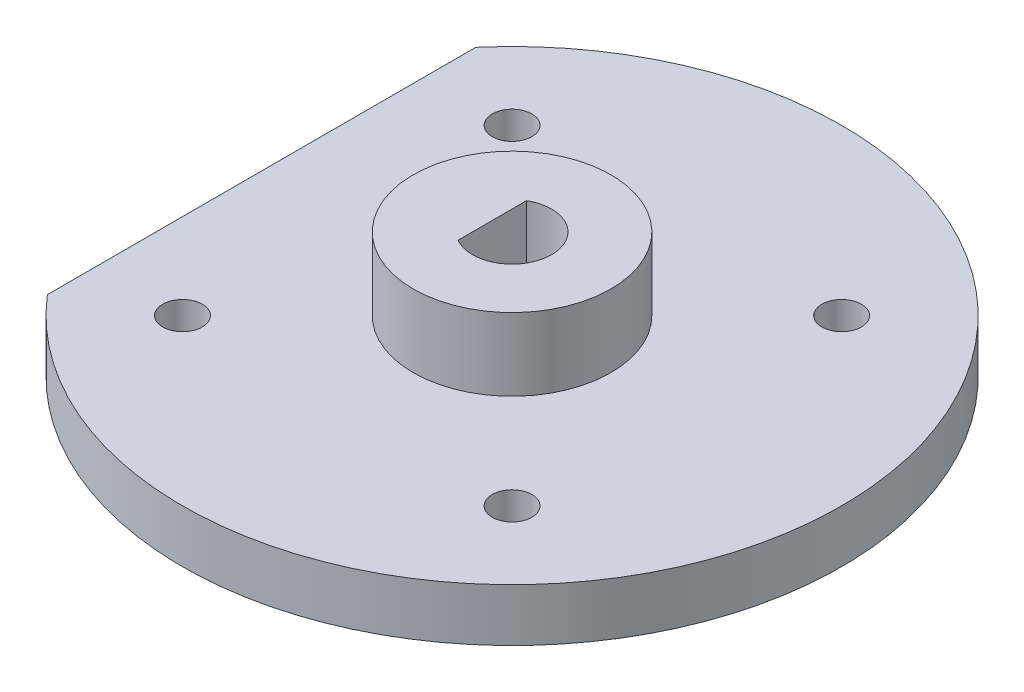
ISO-10303-21;
HEADER;
FILE_DESCRIPTION(('STEP AP214'),'2;1');
FILE_NAME('part.step','',(''),(''),'','','');
FILE_SCHEMA(('AUTOMOTIVE_DESIGN { 1 0 10303 214 1 1 1 1 }'));
ENDSEC;
DATA;
#1=APPLICATION_CONTEXT('core data for automotive mechanical design processes');
#2=APPLICATION_PROTOCOL_DEFINITION('international standard','automotive_design',2000,#1);
#3=PRODUCT_CONTEXT('',#1,'mechanical');
#4=PRODUCT('Part','Part','',(#3));
#5=PRODUCT_RELATED_PRODUCT_CATEGORY('part','',(#4));
#6=PRODUCT_DEFINITION_FORMATION('','',#4);
#7=PRODUCT_DEFINITION_CONTEXT('part definition',#1,'design');
#8=PRODUCT_DEFINITION('design','',#6,#7);
#9=PRODUCT_DEFINITION_SHAPE('','',#8);
#10=(LENGTH_UNIT() NAMED_UNIT(*) SI_UNIT(.MILLI.,.METRE.));
#11=(NAMED_UNIT(*) PLANE_ANGLE_UNIT() SI_UNIT($,.RADIAN.));
#12=(NAMED_UNIT(*) SI_UNIT($,.STERADIAN.) SOLID_ANGLE_UNIT());
#13=UNCERTAINTY_MEASURE_WITH_UNIT(LENGTH_MEASURE(1.E-05),#10,'distance_accuracy_value','');
#14=(GEOMETRIC_REPRESENTATION_CONTEXT(3) GLOBAL_UNCERTAINTY_ASSIGNED_CONTEXT((#13)) GLOBAL_UNIT_ASSIGNED_CONTEXT((#10,
#11,#12)) REPRESENTATION_CONTEXT('',''));
#15=CARTESIAN_POINT('',(0.,0.,0.));
#16=DIRECTION('',(0.,0.,1.));
#17=DIRECTION('',(1.,0.,0.));
#18=AXIS2_PLACEMENT_3D('',#15,#16,#17);
#19=CARTESIAN_POINT('',(0.,4.,0.));
#20=DIRECTION('',(0.,1.,0.));
#21=DIRECTION('',(0.,0.,1.));
#22=AXIS2_PLACEMENT_3D('',#19,#20,#21);
#23=PLANE('',#22);
#24=CARTESIAN_POINT('',(-12.5,4.,-12.5));
#25=DIRECTION('',(0.,1.,0.));
#26=DIRECTION('',(0.,0.,1.));
#27=AXIS2_PLACEMENT_3D('',#24,#25,#26);
#28=CIRCLE('',#27,1.5);
#29=CARTESIAN_POINT('',(-12.5,4.,-11.));
#30=VERTEX_POINT('',#29);
#31=EDGE_CURVE('E109',#30,#30,#28,.T.);
#32=ORIENTED_EDGE('',*,*,#31,.F.);
#33=EDGE_LOOP('',(#32));
#34=FACE_BOUND('',#33,.T.);
#35=CARTESIAN_POINT('',(12.5,4.,12.5));
#36=DIRECTION('',(0.,1.,0.));
#37=DIRECTION('',(0.,0.,1.));
#38=AXIS2_PLACEMENT_3D('',#35,#36,#37);
#39=CIRCLE('',#38,1.5);
#40=CARTESIAN_POINT('',(12.5,4.,14.));
#41=VERTEX_POINT('',#40);
#42=EDGE_CURVE('E97',#41,#41,#39,.T.);
#43=ORIENTED_EDGE('',*,*,#42,.F.);
#44=EDGE_LOOP('',(#43));
#45=FACE_BOUND('',#44,.T.);
#46=CARTESIAN_POINT('',(0.,4.,0.));
#47=DIRECTION('',(0.,1.,0.));
#48=DIRECTION('',(0.,0.,1.));
#49=AXIS2_PLACEMENT_3D('',#46,#47,#48);
#50=CIRCLE('',#49,25.);
#51=CARTESIAN_POINT('',(-19.,4.,16.2480768092719));
#52=VERTEX_POINT('',#51);
#53=CARTESIAN_POINT('',(-19.,4.,-16.2480768092719));
#54=VERTEX_POINT('',#53);
#55=EDGE_CURVE('E75',#52,#54,#50,.T.);
#56=ORIENTED_EDGE('',*,*,#55,.T.);
#57=DIRECTION('',(0.,0.,1.));
#58=VECTOR('',#57,1.);
#59=CARTESIAN_POINT('',(-19.,4.,-16.2480768092719));
#60=LINE('',#59,#58);
#61=EDGE_CURVE('E56',#54,#52,#60,.T.);
#62=ORIENTED_EDGE('',*,*,#61,.T.);
#63=EDGE_LOOP('',(#56,#62));
#64=FACE_BOUND('',#63,.T.);
#65=CARTESIAN_POINT('',(12.5,4.,-12.5));
#66=DIRECTION('',(0.,1.,0.));
#67=DIRECTION('',(0.,0.,1.));
#68=AXIS2_PLACEMENT_3D('',#65,#66,#67);
#69=CIRCLE('',#68,1.5);
#70=CARTESIAN_POINT('',(12.5,4.,-11.));
#71=VERTEX_POINT('',#70);
#72=EDGE_CURVE('E93',#71,#71,#69,.T.);
#73=ORIENTED_EDGE('',*,*,#72,.F.);
#74=EDGE_LOOP('',(#73));
#75=FACE_BOUND('',#74,.T.);
#76=CARTESIAN_POINT('',(-12.5,4.,12.5));
#77=DIRECTION('',(0.,1.,0.));
#78=DIRECTION('',(0.,0.,1.));
#79=AXIS2_PLACEMENT_3D('',#76,#77,#78);
#80=CIRCLE('',#79,1.5);
#81=CARTESIAN_POINT('',(-12.5,4.,14.));
#82=VERTEX_POINT('',#81);
#83=EDGE_CURVE('E103',#82,#82,#80,.T.);
#84=ORIENTED_EDGE('',*,*,#83,.F.);
#85=EDGE_LOOP('',(#84));
#86=FACE_BOUND('',#85,.T.);
#87=CARTESIAN_POINT('',(0.,4.,0.));
#88=DIRECTION('',(0.,1.,0.));
#89=DIRECTION('',(0.,0.,1.));
#90=AXIS2_PLACEMENT_3D('',#87,#88,#89);
#91=CIRCLE('',#90,7.5);
#92=CARTESIAN_POINT('',(0.,4.,7.5));
#93=VERTEX_POINT('',#92);
#94=EDGE_CURVE('E118',#93,#93,#91,.T.);
#95=ORIENTED_EDGE('',*,*,#94,.F.);
#96=EDGE_LOOP('',(#95));
#97=FACE_BOUND('',#96,.T.);
#98=ADVANCED_FACE('F33',(#34,#45,#64,#75,#86,#97),#23,.T.);
#99=CARTESIAN_POINT('',(0.,0.,0.));
#100=DIRECTION('',(0.,1.,0.));
#101=DIRECTION('',(0.,0.,1.));
#102=AXIS2_PLACEMENT_3D('',#99,#100,#101);
#103=PLANE('',#102);
#104=CARTESIAN_POINT('',(0.,0.,0.));
#105=DIRECTION('',(0.,1.,0.));
#106=DIRECTION('',(0.,0.,1.));
#107=AXIS2_PLACEMENT_3D('',#104,#105,#106);
#108=CIRCLE('',#107,25.);
#109=CARTESIAN_POINT('',(-19.,0.,16.2480768092719));
#110=VERTEX_POINT('',#109);
#111=CARTESIAN_POINT('',(-19.,0.,-16.2480768092719));
#112=VERTEX_POINT('',#111);
#113=EDGE_CURVE('E76',#110,#112,#108,.T.);
#114=ORIENTED_EDGE('',*,*,#113,.F.);
#115=DIRECTION('',(0.,0.,1.));
#116=VECTOR('',#115,1.);
#117=CARTESIAN_POINT('',(-19.,0.,-16.2480768092719));
#118=LINE('',#117,#116);
#119=EDGE_CURVE('E67',#112,#110,#118,.T.);
#120=ORIENTED_EDGE('',*,*,#119,.F.);
#121=EDGE_LOOP('',(#114,#120));
#122=FACE_BOUND('',#121,.T.);
#123=CARTESIAN_POINT('',(0.,0.,0.));
#124=DIRECTION('',(0.,1.,0.));
#125=DIRECTION('',(0.,0.,1.));
#126=AXIS2_PLACEMENT_3D('',#123,#124,#125);
#127=CIRCLE('',#126,3.);
#128=CARTESIAN_POINT('',(-1.5,0.,2.59807621135332));
#129=VERTEX_POINT('',#128);
#130=CARTESIAN_POINT('',(-1.5,0.,-2.59807621135332));
#131=VERTEX_POINT('',#130);
#132=EDGE_CURVE('E48',#129,#131,#127,.T.);
#133=ORIENTED_EDGE('',*,*,#132,.T.);
#134=DIRECTION('',(0.,0.,1.));
#135=VECTOR('',#134,1.);
#136=CARTESIAN_POINT('',(-1.5,0.,-2.59807621135332));
#137=LINE('',#136,#135);
#138=EDGE_CURVE('E89',#131,#129,#137,.T.);
#139=ORIENTED_EDGE('',*,*,#138,.T.);
#140=EDGE_LOOP('',(#133,#139));
#141=FACE_BOUND('',#140,.T.);
#142=CARTESIAN_POINT('',(12.5,0.,-12.5));
#143=DIRECTION('',(0.,1.,0.));
#144=DIRECTION('',(0.,0.,1.));
#145=AXIS2_PLACEMENT_3D('',#142,#143,#144);
#146=CIRCLE('',#145,1.5);
#147=CARTESIAN_POINT('',(12.5,0.,-11.));
#148=VERTEX_POINT('',#147);
#149=EDGE_CURVE('E94',#148,#148,#146,.T.);
#150=ORIENTED_EDGE('',*,*,#149,.T.);
#151=EDGE_LOOP('',(#150));
#152=FACE_BOUND('',#151,.T.);
#153=CARTESIAN_POINT('',(12.5,0.,12.5));
#154=DIRECTION('',(0.,1.,0.));
#155=DIRECTION('',(0.,0.,1.));
#156=AXIS2_PLACEMENT_3D('',#153,#154,#155);
#157=CIRCLE('',#156,1.5);
#158=CARTESIAN_POINT('',(12.5,0.,14.));
#159=VERTEX_POINT('',#158);
#160=EDGE_CURVE('E100',#159,#159,#157,.T.);
#161=ORIENTED_EDGE('',*,*,#160,.T.);
#162=EDGE_LOOP('',(#161));
#163=FACE_BOUND('',#162,.T.);
#164=CARTESIAN_POINT('',(-12.5,0.,12.5));
#165=DIRECTION('',(0.,1.,0.));
#166=DIRECTION('',(0.,0.,1.));
#167=AXIS2_PLACEMENT_3D('',#164,#165,#166);
#168=CIRCLE('',#167,1.5);
#169=CARTESIAN_POINT('',(-12.5,0.,14.));
#170=VERTEX_POINT('',#169);
#171=EDGE_CURVE('E106',#170,#170,#168,.T.);
#172=ORIENTED_EDGE('',*,*,#171,.T.);
#173=EDGE_LOOP('',(#172));
#174=FACE_BOUND('',#173,.T.);
#175=CARTESIAN_POINT('',(-12.5,0.,-12.5));
#176=DIRECTION('',(0.,1.,0.));
#177=DIRECTION('',(0.,0.,1.));
#178=AXIS2_PLACEMENT_3D('',#175,#176,#177);
#179=CIRCLE('',#178,1.5);
#180=CARTESIAN_POINT('',(-12.5,0.,-11.));
#181=VERTEX_POINT('',#180);
#182=EDGE_CURVE('E112',#181,#181,#179,.T.);
#183=ORIENTED_EDGE('',*,*,#182,.T.);
#184=EDGE_LOOP('',(#183));
#185=FACE_BOUND('',#184,.T.);
#186=ADVANCED_FACE('F79',(#122,#141,#152,#163,#174,#185),#103,.F.);
#187=CARTESIAN_POINT('',(0.,4.,0.));
#188=DIRECTION('',(0.,-1.,0.));
#189=DIRECTION('',(0.,0.,-1.));
#190=AXIS2_PLACEMENT_3D('',#187,#188,#189);
#191=CYLINDRICAL_SURFACE('',#190,25.);
#192=ORIENTED_EDGE('',*,*,#113,.T.);
#193=DIRECTION('',(0.,-1.,0.));
#194=VECTOR('',#193,1.);
#195=CARTESIAN_POINT('',(-19.,4.,-16.2480768092719));
#196=LINE('',#195,#194);
#197=EDGE_CURVE('E11',#54,#112,#196,.T.);
#198=ORIENTED_EDGE('',*,*,#197,.F.);
#199=ORIENTED_EDGE('',*,*,#55,.F.);
#200=DIRECTION('',(0.,-1.,0.));
#201=VECTOR('',#200,1.);
#202=CARTESIAN_POINT('',(-19.,4.,16.2480768092719));
#203=LINE('',#202,#201);
#204=EDGE_CURVE('E41',#52,#110,#203,.T.);
#205=ORIENTED_EDGE('',*,*,#204,.T.);
#206=EDGE_LOOP('',(#192,#198,#199,#205));
#207=FACE_BOUND('',#206,.T.);
#208=ADVANCED_FACE('F35',(#207),#191,.T.);
#209=CARTESIAN_POINT('',(-19.,4.,-16.2480768092719));
#210=DIRECTION('',(1.,0.,0.));
#211=DIRECTION('',(0.,0.,-1.));
#212=AXIS2_PLACEMENT_3D('',#209,#210,#211);
#213=PLANE('',#212);
#214=ORIENTED_EDGE('',*,*,#119,.T.);
#215=ORIENTED_EDGE('',*,*,#204,.F.);
#216=ORIENTED_EDGE('',*,*,#61,.F.);
#217=ORIENTED_EDGE('',*,*,#197,.T.);
#218=EDGE_LOOP('',(#214,#215,#216,#217));
#219=FACE_BOUND('',#218,.T.);
#220=ADVANCED_FACE('F69',(#219),#213,.F.);
#221=CARTESIAN_POINT('',(0.,4.,0.));
#222=DIRECTION('',(0.,-1.,0.));
#223=DIRECTION('',(0.,0.,-1.));
#224=AXIS2_PLACEMENT_3D('',#221,#222,#223);
#225=CYLINDRICAL_SURFACE('',#224,3.);
#226=ORIENTED_EDGE('',*,*,#132,.F.);
#227=DIRECTION('',(0.,-1.,0.));
#228=VECTOR('',#227,1.);
#229=CARTESIAN_POINT('',(-1.5,4.,2.59807621135332));
#230=LINE('',#229,#228);
#231=CARTESIAN_POINT('',(-1.5,9.5,2.59807621135332));
#232=VERTEX_POINT('',#231);
#233=EDGE_CURVE('E83',#232,#129,#230,.T.);
#234=ORIENTED_EDGE('',*,*,#233,.F.);
#235=CARTESIAN_POINT('',(0.,9.5,0.));
#236=DIRECTION('',(0.,1.,0.));
#237=DIRECTION('',(0.,0.,1.));
#238=AXIS2_PLACEMENT_3D('',#235,#236,#237);
#239=CIRCLE('',#238,3.);
#240=CARTESIAN_POINT('',(-1.5,9.5,-2.59807621135332));
#241=VERTEX_POINT('',#240);
#242=EDGE_CURVE('E126',#232,#241,#239,.T.);
#243=ORIENTED_EDGE('',*,*,#242,.T.);
#244=DIRECTION('',(0.,-1.,0.));
#245=VECTOR('',#244,1.);
#246=CARTESIAN_POINT('',(-1.5,4.,-2.59807621135332));
#247=LINE('',#246,#245);
#248=EDGE_CURVE('E81',#241,#131,#247,.T.);
#249=ORIENTED_EDGE('',*,*,#248,.T.);
#250=EDGE_LOOP('',(#226,#234,#243,#249));
#251=FACE_BOUND('',#250,.T.);
#252=ADVANCED_FACE('F131',(#251),#225,.F.);
#253=CARTESIAN_POINT('',(-1.5,4.,-2.59807621135332));
#254=DIRECTION('',(1.,0.,0.));
#255=DIRECTION('',(0.,0.,-1.));
#256=AXIS2_PLACEMENT_3D('',#253,#254,#255);
#257=PLANE('',#256);
#258=ORIENTED_EDGE('',*,*,#138,.F.);
#259=ORIENTED_EDGE('',*,*,#248,.F.);
#260=DIRECTION('',(0.,0.,1.));
#261=VECTOR('',#260,1.);
#262=CARTESIAN_POINT('',(-1.5,9.5,-2.59807621135332));
#263=LINE('',#262,#261);
#264=EDGE_CURVE('E121',#241,#232,#263,.T.);
#265=ORIENTED_EDGE('',*,*,#264,.T.);
#266=ORIENTED_EDGE('',*,*,#233,.T.);
#267=EDGE_LOOP('',(#258,#259,#265,#266));
#268=FACE_BOUND('',#267,.T.);
#269=ADVANCED_FACE('F139',(#268),#257,.T.);
#270=CARTESIAN_POINT('',(12.5,4.,-12.5));
#271=DIRECTION('',(0.,-1.,0.));
#272=DIRECTION('',(0.,0.,-1.));
#273=AXIS2_PLACEMENT_3D('',#270,#271,#272);
#274=CYLINDRICAL_SURFACE('',#273,1.5);
#275=ORIENTED_EDGE('',*,*,#72,.T.);
#276=EDGE_LOOP('',(#275));
#277=FACE_BOUND('',#276,.T.);
#278=ORIENTED_EDGE('',*,*,#149,.F.);
#279=EDGE_LOOP('',(#278));
#280=FACE_BOUND('',#279,.T.);
#281=ADVANCED_FACE('F213',(#277,#280),#274,.F.);
#282=CARTESIAN_POINT('',(12.5,4.,12.5));
#283=DIRECTION('',(0.,-1.,0.));
#284=DIRECTION('',(0.,0.,-1.));
#285=AXIS2_PLACEMENT_3D('',#282,#283,#284);
#286=CYLINDRICAL_SURFACE('',#285,1.5);
#287=ORIENTED_EDGE('',*,*,#42,.T.);
#288=EDGE_LOOP('',(#287));
#289=FACE_BOUND('',#288,.T.);
#290=ORIENTED_EDGE('',*,*,#160,.F.);
#291=EDGE_LOOP('',(#290));
#292=FACE_BOUND('',#291,.T.);
#293=ADVANCED_FACE('F164',(#289,#292),#286,.F.);
#294=CARTESIAN_POINT('',(-12.5,4.,12.5));
#295=DIRECTION('',(0.,-1.,0.));
#296=DIRECTION('',(0.,0.,-1.));
#297=AXIS2_PLACEMENT_3D('',#294,#295,#296);
#298=CYLINDRICAL_SURFACE('',#297,1.5);
#299=ORIENTED_EDGE('',*,*,#83,.T.);
#300=EDGE_LOOP('',(#299));
#301=FACE_BOUND('',#300,.T.);
#302=ORIENTED_EDGE('',*,*,#171,.F.);
#303=EDGE_LOOP('',(#302));
#304=FACE_BOUND('',#303,.T.);
#305=ADVANCED_FACE('F154',(#301,#304),#298,.F.);
#306=CARTESIAN_POINT('',(-12.5,4.,-12.5));
#307=DIRECTION('',(0.,-1.,0.));
#308=DIRECTION('',(0.,0.,-1.));
#309=AXIS2_PLACEMENT_3D('',#306,#307,#308);
#310=CYLINDRICAL_SURFACE('',#309,1.5);
#311=ORIENTED_EDGE('',*,*,#31,.T.);
#312=EDGE_LOOP('',(#311));
#313=FACE_BOUND('',#312,.T.);
#314=ORIENTED_EDGE('',*,*,#182,.F.);
#315=EDGE_LOOP('',(#314));
#316=FACE_BOUND('',#315,.T.);
#317=ADVANCED_FACE('F152',(#313,#316),#310,.F.);
#318=CARTESIAN_POINT('',(0.,9.5,0.));
#319=DIRECTION('',(0.,1.,0.));
#320=DIRECTION('',(0.,0.,1.));
#321=AXIS2_PLACEMENT_3D('',#318,#319,#320);
#322=PLANE('',#321);
#323=CARTESIAN_POINT('',(0.,9.5,0.));
#324=DIRECTION('',(0.,1.,0.));
#325=DIRECTION('',(0.,0.,1.));
#326=AXIS2_PLACEMENT_3D('',#323,#324,#325);
#327=CIRCLE('',#326,7.5);
#328=CARTESIAN_POINT('',(0.,9.5,7.5));
#329=VERTEX_POINT('',#328);
#330=EDGE_CURVE('E115',#329,#329,#327,.T.);
#331=ORIENTED_EDGE('',*,*,#330,.T.);
#332=EDGE_LOOP('',(#331));
#333=FACE_BOUND('',#332,.T.);
#334=ORIENTED_EDGE('',*,*,#264,.F.);
#335=ORIENTED_EDGE('',*,*,#242,.F.);
#336=EDGE_LOOP('',(#334,#335));
#337=FACE_BOUND('',#336,.T.);
#338=ADVANCED_FACE('F136',(#333,#337),#322,.T.);
#339=CARTESIAN_POINT('',(0.,9.5,0.));
#340=DIRECTION('',(0.,-1.,0.));
#341=DIRECTION('',(0.,0.,-1.));
#342=AXIS2_PLACEMENT_3D('',#339,#340,#341);
#343=CYLINDRICAL_SURFACE('',#342,7.5);
#344=ORIENTED_EDGE('',*,*,#330,.F.);
#345=EDGE_LOOP('',(#344));
#346=FACE_BOUND('',#345,.T.);
#347=ORIENTED_EDGE('',*,*,#94,.T.);
#348=EDGE_LOOP('',(#347));
#349=FACE_BOUND('',#348,.T.);
#350=ADVANCED_FACE('F161',(#346,#349),#343,.T.);
#351=CLOSED_SHELL('',(#98,#186,#208,#220,#252,#269,#281,#293,#305,#317,#338,#350));
#352=MANIFOLD_SOLID_BREP('B2',#351);
#353=ADVANCED_BREP_SHAPE_REPRESENTATION('',(#18,#352),#14);
#354=SHAPE_DEFINITION_REPRESENTATION(#9,#353);
ENDSEC;
END-ISO-10303-21;
